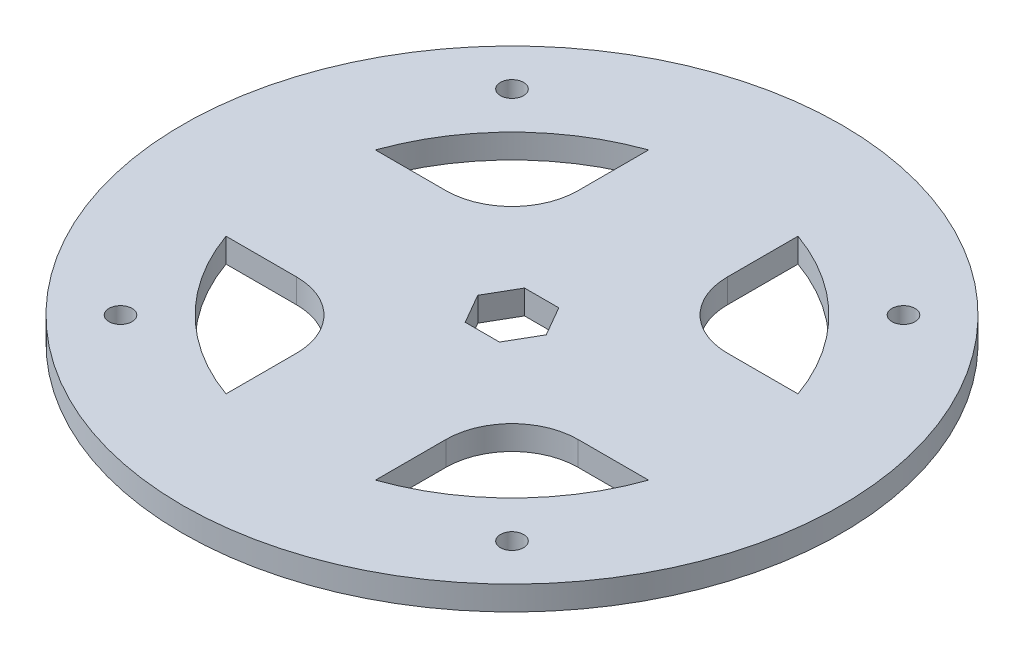
ISO-10303-21;
HEADER;
FILE_DESCRIPTION(('STEP AP214'),'2;1');
FILE_NAME('part.step','',(''),(''),'','','');
FILE_SCHEMA(('AUTOMOTIVE_DESIGN { 1 0 10303 214 1 1 1 1 }'));
ENDSEC;
DATA;
#1=APPLICATION_CONTEXT('core data for automotive mechanical design processes');
#2=APPLICATION_PROTOCOL_DEFINITION('international standard','automotive_design',2000,#1);
#3=PRODUCT_CONTEXT('',#1,'mechanical');
#4=PRODUCT('Part','Part','',(#3));
#5=PRODUCT_RELATED_PRODUCT_CATEGORY('part','',(#4));
#6=PRODUCT_DEFINITION_FORMATION('','',#4);
#7=PRODUCT_DEFINITION_CONTEXT('part definition',#1,'design');
#8=PRODUCT_DEFINITION('design','',#6,#7);
#9=PRODUCT_DEFINITION_SHAPE('','',#8);
#10=(LENGTH_UNIT() NAMED_UNIT(*) SI_UNIT(.MILLI.,.METRE.));
#11=(NAMED_UNIT(*) PLANE_ANGLE_UNIT() SI_UNIT($,.RADIAN.));
#12=(NAMED_UNIT(*) SI_UNIT($,.STERADIAN.) SOLID_ANGLE_UNIT());
#13=UNCERTAINTY_MEASURE_WITH_UNIT(LENGTH_MEASURE(1.E-05),#10,'distance_accuracy_value','');
#14=(GEOMETRIC_REPRESENTATION_CONTEXT(3) GLOBAL_UNCERTAINTY_ASSIGNED_CONTEXT((#13)) GLOBAL_UNIT_ASSIGNED_CONTEXT((#10,
#11,#12)) REPRESENTATION_CONTEXT('',''));
#15=CARTESIAN_POINT('',(0.,0.,0.));
#16=DIRECTION('',(0.,0.,1.));
#17=DIRECTION('',(1.,0.,0.));
#18=AXIS2_PLACEMENT_3D('',#15,#16,#17);
#19=CARTESIAN_POINT('',(0.,5.5,0.));
#20=DIRECTION('',(0.,1.,0.));
#21=DIRECTION('',(0.,0.,1.));
#22=AXIS2_PLACEMENT_3D('',#19,#20,#21);
#23=PLANE('',#22);
#24=CARTESIAN_POINT('',(-32.,5.5,32.));
#25=DIRECTION('',(0.,1.,0.));
#26=DIRECTION('',(0.,0.,-1.));
#27=AXIS2_PLACEMENT_3D('',#24,#25,#26);
#28=CIRCLE('',#27,15.);
#29=CARTESIAN_POINT('',(-17.,5.5,32.));
#30=VERTEX_POINT('',#29);
#31=CARTESIAN_POINT('',(-32.,5.5,17.));
#32=VERTEX_POINT('',#31);
#33=EDGE_CURVE('E55',#30,#32,#28,.T.);
#34=ORIENTED_EDGE('',*,*,#33,.F.);
#35=DIRECTION('',(0.,0.,-1.));
#36=VECTOR('',#35,1.);
#37=CARTESIAN_POINT('',(-17.,5.5,32.));
#38=LINE('',#37,#36);
#39=CARTESIAN_POINT('',(-17.,5.5,48.0832611206852));
#40=VERTEX_POINT('',#39);
#41=EDGE_CURVE('E259',#40,#30,#38,.T.);
#42=ORIENTED_EDGE('',*,*,#41,.F.);
#43=CARTESIAN_POINT('',(0.,5.5,0.));
#44=DIRECTION('',(0.,1.,0.));
#45=DIRECTION('',(0.,0.,-1.));
#46=AXIS2_PLACEMENT_3D('',#43,#44,#45);
#47=CIRCLE('',#46,51.);
#48=CARTESIAN_POINT('',(-48.0832611206852,5.5,17.));
#49=VERTEX_POINT('',#48);
#50=EDGE_CURVE('E255',#49,#40,#47,.T.);
#51=ORIENTED_EDGE('',*,*,#50,.F.);
#52=DIRECTION('',(-1.,0.,0.));
#53=VECTOR('',#52,1.);
#54=CARTESIAN_POINT('',(-32.,5.5,17.));
#55=LINE('',#54,#53);
#56=EDGE_CURVE('E250',#32,#49,#55,.T.);
#57=ORIENTED_EDGE('',*,*,#56,.F.);
#58=EDGE_LOOP('',(#34,#42,#51,#57));
#59=FACE_BOUND('',#58,.T.);
#60=CARTESIAN_POINT('',(32.,5.5,-32.));
#61=DIRECTION('',(0.,1.,0.));
#62=DIRECTION('',(0.,0.,-1.));
#63=AXIS2_PLACEMENT_3D('',#60,#61,#62);
#64=CIRCLE('',#63,15.);
#65=CARTESIAN_POINT('',(17.,5.5,-32.));
#66=VERTEX_POINT('',#65);
#67=CARTESIAN_POINT('',(32.,5.5,-17.));
#68=VERTEX_POINT('',#67);
#69=EDGE_CURVE('E63',#66,#68,#64,.T.);
#70=ORIENTED_EDGE('',*,*,#69,.F.);
#71=DIRECTION('',(0.,0.,1.));
#72=VECTOR('',#71,1.);
#73=CARTESIAN_POINT('',(17.,5.5,-32.));
#74=LINE('',#73,#72);
#75=CARTESIAN_POINT('',(17.,5.5,-48.0832611206852));
#76=VERTEX_POINT('',#75);
#77=EDGE_CURVE('E298',#76,#66,#74,.T.);
#78=ORIENTED_EDGE('',*,*,#77,.F.);
#79=CARTESIAN_POINT('',(0.,5.5,0.));
#80=DIRECTION('',(0.,1.,0.));
#81=DIRECTION('',(0.,0.,-1.));
#82=AXIS2_PLACEMENT_3D('',#79,#80,#81);
#83=CIRCLE('',#82,51.);
#84=CARTESIAN_POINT('',(48.0832611206852,5.5,-17.));
#85=VERTEX_POINT('',#84);
#86=EDGE_CURVE('E294',#85,#76,#83,.T.);
#87=ORIENTED_EDGE('',*,*,#86,.F.);
#88=DIRECTION('',(1.,0.,0.));
#89=VECTOR('',#88,1.);
#90=CARTESIAN_POINT('',(32.,5.5,-17.));
#91=LINE('',#90,#89);
#92=EDGE_CURVE('E290',#68,#85,#91,.T.);
#93=ORIENTED_EDGE('',*,*,#92,.F.);
#94=EDGE_LOOP('',(#70,#78,#87,#93));
#95=FACE_BOUND('',#94,.T.);
#96=CARTESIAN_POINT('',(-32.,5.5,-32.));
#97=DIRECTION('',(0.,1.,0.));
#98=DIRECTION('',(0.,0.,1.));
#99=AXIS2_PLACEMENT_3D('',#96,#97,#98);
#100=CIRCLE('',#99,15.);
#101=CARTESIAN_POINT('',(-32.,5.5,-17.));
#102=VERTEX_POINT('',#101);
#103=CARTESIAN_POINT('',(-17.,5.5,-32.));
#104=VERTEX_POINT('',#103);
#105=EDGE_CURVE('E214',#102,#104,#100,.T.);
#106=ORIENTED_EDGE('',*,*,#105,.F.);
#107=DIRECTION('',(1.,0.,0.));
#108=VECTOR('',#107,1.);
#109=CARTESIAN_POINT('',(-32.,5.5,-17.));
#110=LINE('',#109,#108);
#111=CARTESIAN_POINT('',(-48.0832611206852,5.5,-17.));
#112=VERTEX_POINT('',#111);
#113=EDGE_CURVE('E218',#112,#102,#110,.T.);
#114=ORIENTED_EDGE('',*,*,#113,.F.);
#115=CARTESIAN_POINT('',(0.,5.5,0.));
#116=DIRECTION('',(0.,1.,0.));
#117=DIRECTION('',(0.,0.,1.));
#118=AXIS2_PLACEMENT_3D('',#115,#116,#117);
#119=CIRCLE('',#118,51.);
#120=CARTESIAN_POINT('',(-17.,5.5,-48.0832611206852));
#121=VERTEX_POINT('',#120);
#122=EDGE_CURVE('E196',#121,#112,#119,.T.);
#123=ORIENTED_EDGE('',*,*,#122,.F.);
#124=DIRECTION('',(0.,0.,-1.));
#125=VECTOR('',#124,1.);
#126=CARTESIAN_POINT('',(-17.,5.5,-32.));
#127=LINE('',#126,#125);
#128=EDGE_CURVE('E208',#104,#121,#127,.T.);
#129=ORIENTED_EDGE('',*,*,#128,.F.);
#130=EDGE_LOOP('',(#106,#114,#123,#129));
#131=FACE_BOUND('',#130,.T.);
#132=CARTESIAN_POINT('',(0.,5.5,0.));
#133=DIRECTION('',(0.,1.,0.));
#134=DIRECTION('',(0.,0.,1.));
#135=AXIS2_PLACEMENT_3D('',#132,#133,#134);
#136=CIRCLE('',#135,51.);
#137=CARTESIAN_POINT('',(17.,5.5,48.0832611206852));
#138=VERTEX_POINT('',#137);
#139=CARTESIAN_POINT('',(48.0832611206852,5.5,17.));
#140=VERTEX_POINT('',#139);
#141=EDGE_CURVE('E276',#138,#140,#136,.T.);
#142=ORIENTED_EDGE('',*,*,#141,.F.);
#143=DIRECTION('',(0.,0.,1.));
#144=VECTOR('',#143,1.);
#145=CARTESIAN_POINT('',(17.,5.5,32.));
#146=LINE('',#145,#144);
#147=CARTESIAN_POINT('',(17.,5.5,32.));
#148=VERTEX_POINT('',#147);
#149=EDGE_CURVE('E337',#148,#138,#146,.T.);
#150=ORIENTED_EDGE('',*,*,#149,.F.);
#151=CARTESIAN_POINT('',(32.,5.5,32.));
#152=DIRECTION('',(0.,1.,0.));
#153=DIRECTION('',(0.,0.,1.));
#154=AXIS2_PLACEMENT_3D('',#151,#152,#153);
#155=CIRCLE('',#154,15.);
#156=CARTESIAN_POINT('',(32.,5.5,17.));
#157=VERTEX_POINT('',#156);
#158=EDGE_CURVE('E333',#157,#148,#155,.T.);
#159=ORIENTED_EDGE('',*,*,#158,.F.);
#160=DIRECTION('',(-1.,0.,0.));
#161=VECTOR('',#160,1.);
#162=CARTESIAN_POINT('',(32.,5.5,17.));
#163=LINE('',#162,#161);
#164=EDGE_CURVE('E329',#140,#157,#163,.T.);
#165=ORIENTED_EDGE('',*,*,#164,.F.);
#166=EDGE_LOOP('',(#142,#150,#159,#165));
#167=FACE_BOUND('',#166,.T.);
#168=CARTESIAN_POINT('',(-44.5477272147521,5.5,44.5477272147529));
#169=DIRECTION('',(0.,1.,0.));
#170=DIRECTION('',(0.,0.,1.));
#171=AXIS2_PLACEMENT_3D('',#168,#169,#170);
#172=CIRCLE('',#171,2.625);
#173=CARTESIAN_POINT('',(-44.5477272147521,5.5,47.1727272147529));
#174=VERTEX_POINT('',#173);
#175=EDGE_CURVE('E425',#174,#174,#172,.T.);
#176=ORIENTED_EDGE('',*,*,#175,.F.);
#177=EDGE_LOOP('',(#176));
#178=FACE_BOUND('',#177,.T.);
#179=CARTESIAN_POINT('',(44.5477272147524,5.5,-44.5477272147526));
#180=DIRECTION('',(0.,1.,0.));
#181=DIRECTION('',(0.,0.,1.));
#182=AXIS2_PLACEMENT_3D('',#179,#180,#181);
#183=CIRCLE('',#182,2.625);
#184=CARTESIAN_POINT('',(44.5477272147524,5.5,-41.9227272147526));
#185=VERTEX_POINT('',#184);
#186=EDGE_CURVE('E365',#185,#185,#183,.T.);
#187=ORIENTED_EDGE('',*,*,#186,.F.);
#188=EDGE_LOOP('',(#187));
#189=FACE_BOUND('',#188,.T.);
#190=CARTESIAN_POINT('',(-44.5477272147527,5.5,-44.5477272147523));
#191=DIRECTION('',(0.,1.,0.));
#192=DIRECTION('',(0.,0.,1.));
#193=AXIS2_PLACEMENT_3D('',#190,#191,#192);
#194=CIRCLE('',#193,2.625);
#195=CARTESIAN_POINT('',(-44.5477272147527,5.5,-41.9227272147523));
#196=VERTEX_POINT('',#195);
#197=EDGE_CURVE('E356',#196,#196,#194,.T.);
#198=ORIENTED_EDGE('',*,*,#197,.F.);
#199=EDGE_LOOP('',(#198));
#200=FACE_BOUND('',#199,.T.);
#201=DIRECTION('',(0.5,0.,-0.866025403784439));
#202=VECTOR('',#201,1.);
#203=CARTESIAN_POINT('',(3.89711431702998,5.5,6.75));
#204=LINE('',#203,#202);
#205=CARTESIAN_POINT('',(3.89711431702998,5.5,6.75));
#206=VERTEX_POINT('',#205);
#207=CARTESIAN_POINT('',(7.79422863405995,5.5,0.));
#208=VERTEX_POINT('',#207);
#209=EDGE_CURVE('E355',#206,#208,#204,.T.);
#210=ORIENTED_EDGE('',*,*,#209,.F.);
#211=DIRECTION('',(1.,0.,0.));
#212=VECTOR('',#211,1.);
#213=CARTESIAN_POINT('',(-3.89711431702997,5.5,6.75));
#214=LINE('',#213,#212);
#215=CARTESIAN_POINT('',(-3.89711431702997,5.5,6.75));
#216=VERTEX_POINT('',#215);
#217=EDGE_CURVE('E401',#216,#206,#214,.T.);
#218=ORIENTED_EDGE('',*,*,#217,.F.);
#219=DIRECTION('',(0.5,0.,0.866025403784439));
#220=VECTOR('',#219,1.);
#221=CARTESIAN_POINT('',(-7.79422863405995,5.5,0.));
#222=LINE('',#221,#220);
#223=CARTESIAN_POINT('',(-7.79422863405995,5.5,0.));
#224=VERTEX_POINT('',#223);
#225=EDGE_CURVE('E397',#224,#216,#222,.T.);
#226=ORIENTED_EDGE('',*,*,#225,.F.);
#227=DIRECTION('',(-0.5,0.,0.866025403784439));
#228=VECTOR('',#227,1.);
#229=CARTESIAN_POINT('',(-3.89711431702998,5.5,-6.75));
#230=LINE('',#229,#228);
#231=CARTESIAN_POINT('',(-3.89711431702998,5.5,-6.75));
#232=VERTEX_POINT('',#231);
#233=EDGE_CURVE('E393',#232,#224,#230,.T.);
#234=ORIENTED_EDGE('',*,*,#233,.F.);
#235=DIRECTION('',(-1.,0.,0.));
#236=VECTOR('',#235,1.);
#237=CARTESIAN_POINT('',(3.89711431702997,5.5,-6.75));
#238=LINE('',#237,#236);
#239=CARTESIAN_POINT('',(3.89711431702997,5.5,-6.75));
#240=VERTEX_POINT('',#239);
#241=EDGE_CURVE('E389',#240,#232,#238,.T.);
#242=ORIENTED_EDGE('',*,*,#241,.F.);
#243=DIRECTION('',(-0.500000000000001,0.,-0.866025403784438));
#244=VECTOR('',#243,1.);
#245=CARTESIAN_POINT('',(7.79422863405995,5.5,0.));
#246=LINE('',#245,#244);
#247=EDGE_CURVE('E385',#208,#240,#246,.T.);
#248=ORIENTED_EDGE('',*,*,#247,.F.);
#249=EDGE_LOOP('',(#210,#218,#226,#234,#242,#248));
#250=FACE_BOUND('',#249,.T.);
#251=CARTESIAN_POINT('',(44.547727214753,5.5,44.547727214752));
#252=DIRECTION('',(0.,1.,0.));
#253=DIRECTION('',(0.,0.,1.));
#254=AXIS2_PLACEMENT_3D('',#251,#252,#253);
#255=CIRCLE('',#254,2.625);
#256=CARTESIAN_POINT('',(44.547727214753,5.5,47.172727214752));
#257=VERTEX_POINT('',#256);
#258=EDGE_CURVE('E434',#257,#257,#255,.T.);
#259=ORIENTED_EDGE('',*,*,#258,.F.);
#260=EDGE_LOOP('',(#259));
#261=FACE_BOUND('',#260,.T.);
#262=CARTESIAN_POINT('',(0.,5.5,0.));
#263=DIRECTION('',(0.,1.,0.));
#264=DIRECTION('',(0.,0.,1.));
#265=AXIS2_PLACEMENT_3D('',#262,#263,#264);
#266=CIRCLE('',#265,75.);
#267=CARTESIAN_POINT('',(0.,5.5,75.));
#268=VERTEX_POINT('',#267);
#269=EDGE_CURVE('E11',#268,#268,#266,.T.);
#270=ORIENTED_EDGE('',*,*,#269,.T.);
#271=EDGE_LOOP('',(#270));
#272=FACE_BOUND('',#271,.T.);
#273=ADVANCED_FACE('F39',(#59,#95,#131,#167,#178,#189,#200,#250,#261,#272),#23,.T.);
#274=CARTESIAN_POINT('',(0.,0.,0.));
#275=DIRECTION('',(0.,1.,0.));
#276=DIRECTION('',(0.,0.,1.));
#277=AXIS2_PLACEMENT_3D('',#274,#275,#276);
#278=PLANE('',#277);
#279=DIRECTION('',(0.,0.,1.));
#280=VECTOR('',#279,1.);
#281=CARTESIAN_POINT('',(-17.,0.,32.));
#282=LINE('',#281,#280);
#283=CARTESIAN_POINT('',(-17.,0.,32.));
#284=VERTEX_POINT('',#283);
#285=CARTESIAN_POINT('',(-17.,0.,48.0832611206852));
#286=VERTEX_POINT('',#285);
#287=EDGE_CURVE('E240',#284,#286,#282,.T.);
#288=ORIENTED_EDGE('',*,*,#287,.F.);
#289=CARTESIAN_POINT('',(-32.,0.,32.));
#290=DIRECTION('',(0.,1.,0.));
#291=DIRECTION('',(0.,0.,1.));
#292=AXIS2_PLACEMENT_3D('',#289,#290,#291);
#293=CIRCLE('',#292,15.);
#294=CARTESIAN_POINT('',(-32.,0.,17.));
#295=VERTEX_POINT('',#294);
#296=EDGE_CURVE('E244',#295,#284,#293,.F.);
#297=ORIENTED_EDGE('',*,*,#296,.F.);
#298=DIRECTION('',(1.,0.,0.));
#299=VECTOR('',#298,1.);
#300=CARTESIAN_POINT('',(-32.,0.,17.));
#301=LINE('',#300,#299);
#302=CARTESIAN_POINT('',(-48.0832611206852,0.,17.));
#303=VERTEX_POINT('',#302);
#304=EDGE_CURVE('E247',#303,#295,#301,.T.);
#305=ORIENTED_EDGE('',*,*,#304,.F.);
#306=CARTESIAN_POINT('',(0.,0.,0.));
#307=DIRECTION('',(0.,1.,0.));
#308=DIRECTION('',(0.,0.,1.));
#309=AXIS2_PLACEMENT_3D('',#306,#307,#308);
#310=CIRCLE('',#309,51.);
#311=EDGE_CURVE('E236',#286,#303,#310,.F.);
#312=ORIENTED_EDGE('',*,*,#311,.F.);
#313=EDGE_LOOP('',(#288,#297,#305,#312));
#314=FACE_BOUND('',#313,.T.);
#315=DIRECTION('',(0.,0.,-1.));
#316=VECTOR('',#315,1.);
#317=CARTESIAN_POINT('',(17.,0.,-32.));
#318=LINE('',#317,#316);
#319=CARTESIAN_POINT('',(17.,0.,-32.));
#320=VERTEX_POINT('',#319);
#321=CARTESIAN_POINT('',(17.,0.,-48.0832611206852));
#322=VERTEX_POINT('',#321);
#323=EDGE_CURVE('E281',#320,#322,#318,.T.);
#324=ORIENTED_EDGE('',*,*,#323,.F.);
#325=CARTESIAN_POINT('',(32.,0.,-32.));
#326=DIRECTION('',(0.,1.,0.));
#327=DIRECTION('',(0.,0.,1.));
#328=AXIS2_PLACEMENT_3D('',#325,#326,#327);
#329=CIRCLE('',#328,15.);
#330=CARTESIAN_POINT('',(32.,0.,-17.));
#331=VERTEX_POINT('',#330);
#332=EDGE_CURVE('E285',#331,#320,#329,.F.);
#333=ORIENTED_EDGE('',*,*,#332,.F.);
#334=DIRECTION('',(-1.,0.,0.));
#335=VECTOR('',#334,1.);
#336=CARTESIAN_POINT('',(32.,0.,-17.));
#337=LINE('',#336,#335);
#338=CARTESIAN_POINT('',(48.0832611206852,0.,-17.));
#339=VERTEX_POINT('',#338);
#340=EDGE_CURVE('E251',#339,#331,#337,.T.);
#341=ORIENTED_EDGE('',*,*,#340,.F.);
#342=CARTESIAN_POINT('',(0.,0.,0.));
#343=DIRECTION('',(0.,1.,0.));
#344=DIRECTION('',(0.,0.,1.));
#345=AXIS2_PLACEMENT_3D('',#342,#343,#344);
#346=CIRCLE('',#345,51.);
#347=EDGE_CURVE('E277',#322,#339,#346,.F.);
#348=ORIENTED_EDGE('',*,*,#347,.F.);
#349=EDGE_LOOP('',(#324,#333,#341,#348));
#350=FACE_BOUND('',#349,.T.);
#351=DIRECTION('',(-1.,0.,0.));
#352=VECTOR('',#351,1.);
#353=CARTESIAN_POINT('',(-32.,0.,-17.));
#354=LINE('',#353,#352);
#355=CARTESIAN_POINT('',(-32.,0.,-17.));
#356=VERTEX_POINT('',#355);
#357=CARTESIAN_POINT('',(-48.0832611206852,0.,-17.));
#358=VERTEX_POINT('',#357);
#359=EDGE_CURVE('E567',#356,#358,#354,.T.);
#360=ORIENTED_EDGE('',*,*,#359,.F.);
#361=CARTESIAN_POINT('',(-32.,0.,-32.));
#362=DIRECTION('',(0.,1.,0.));
#363=DIRECTION('',(0.,0.,1.));
#364=AXIS2_PLACEMENT_3D('',#361,#362,#363);
#365=CIRCLE('',#364,15.);
#366=CARTESIAN_POINT('',(-17.,0.,-32.));
#367=VERTEX_POINT('',#366);
#368=EDGE_CURVE('E235',#367,#356,#365,.F.);
#369=ORIENTED_EDGE('',*,*,#368,.F.);
#370=DIRECTION('',(0.,0.,1.));
#371=VECTOR('',#370,1.);
#372=CARTESIAN_POINT('',(-17.,0.,-32.));
#373=LINE('',#372,#371);
#374=CARTESIAN_POINT('',(-17.,0.,-48.0832611206852));
#375=VERTEX_POINT('',#374);
#376=EDGE_CURVE('E232',#375,#367,#373,.T.);
#377=ORIENTED_EDGE('',*,*,#376,.F.);
#378=CARTESIAN_POINT('',(0.,0.,0.));
#379=DIRECTION('',(0.,1.,0.));
#380=DIRECTION('',(0.,0.,1.));
#381=AXIS2_PLACEMENT_3D('',#378,#379,#380);
#382=CIRCLE('',#381,51.);
#383=EDGE_CURVE('E199',#358,#375,#382,.F.);
#384=ORIENTED_EDGE('',*,*,#383,.F.);
#385=EDGE_LOOP('',(#360,#369,#377,#384));
#386=FACE_BOUND('',#385,.T.);
#387=DIRECTION('',(0.,0.,-1.));
#388=VECTOR('',#387,1.);
#389=CARTESIAN_POINT('',(17.,0.,32.));
#390=LINE('',#389,#388);
#391=CARTESIAN_POINT('',(17.,0.,48.0832611206852));
#392=VERTEX_POINT('',#391);
#393=CARTESIAN_POINT('',(17.,0.,32.));
#394=VERTEX_POINT('',#393);
#395=EDGE_CURVE('E319',#392,#394,#390,.T.);
#396=ORIENTED_EDGE('',*,*,#395,.F.);
#397=CARTESIAN_POINT('',(0.,0.,0.));
#398=DIRECTION('',(0.,1.,0.));
#399=DIRECTION('',(0.,0.,1.));
#400=AXIS2_PLACEMENT_3D('',#397,#398,#399);
#401=CIRCLE('',#400,51.);
#402=CARTESIAN_POINT('',(48.0832611206852,0.,17.));
#403=VERTEX_POINT('',#402);
#404=EDGE_CURVE('E323',#403,#392,#401,.F.);
#405=ORIENTED_EDGE('',*,*,#404,.F.);
#406=DIRECTION('',(1.,0.,0.));
#407=VECTOR('',#406,1.);
#408=CARTESIAN_POINT('',(32.,0.,17.));
#409=LINE('',#408,#407);
#410=CARTESIAN_POINT('',(32.,0.,17.));
#411=VERTEX_POINT('',#410);
#412=EDGE_CURVE('E326',#411,#403,#409,.T.);
#413=ORIENTED_EDGE('',*,*,#412,.F.);
#414=CARTESIAN_POINT('',(32.,0.,32.));
#415=DIRECTION('',(0.,1.,0.));
#416=DIRECTION('',(0.,0.,1.));
#417=AXIS2_PLACEMENT_3D('',#414,#415,#416);
#418=CIRCLE('',#417,15.);
#419=EDGE_CURVE('E315',#394,#411,#418,.F.);
#420=ORIENTED_EDGE('',*,*,#419,.F.);
#421=EDGE_LOOP('',(#396,#405,#413,#420));
#422=FACE_BOUND('',#421,.T.);
#423=CARTESIAN_POINT('',(-44.5477272147521,0.,44.5477272147529));
#424=DIRECTION('',(0.,1.,0.));
#425=DIRECTION('',(0.,0.,1.));
#426=AXIS2_PLACEMENT_3D('',#423,#424,#425);
#427=CIRCLE('',#426,2.625);
#428=CARTESIAN_POINT('',(-44.5477272147521,0.,47.1727272147529));
#429=VERTEX_POINT('',#428);
#430=EDGE_CURVE('E429',#429,#429,#427,.F.);
#431=ORIENTED_EDGE('',*,*,#430,.F.);
#432=EDGE_LOOP('',(#431));
#433=FACE_BOUND('',#432,.T.);
#434=CARTESIAN_POINT('',(44.5477272147524,0.,-44.5477272147526));
#435=DIRECTION('',(0.,1.,0.));
#436=DIRECTION('',(0.,0.,1.));
#437=AXIS2_PLACEMENT_3D('',#434,#435,#436);
#438=CIRCLE('',#437,2.625);
#439=CARTESIAN_POINT('',(44.5477272147524,0.,-41.9227272147526));
#440=VERTEX_POINT('',#439);
#441=EDGE_CURVE('E430',#440,#440,#438,.F.);
#442=ORIENTED_EDGE('',*,*,#441,.F.);
#443=EDGE_LOOP('',(#442));
#444=FACE_BOUND('',#443,.T.);
#445=CARTESIAN_POINT('',(-44.5477272147527,0.,-44.5477272147523));
#446=DIRECTION('',(0.,1.,0.));
#447=DIRECTION('',(0.,0.,1.));
#448=AXIS2_PLACEMENT_3D('',#445,#446,#447);
#449=CIRCLE('',#448,2.625);
#450=CARTESIAN_POINT('',(-44.5477272147527,0.,-41.9227272147523));
#451=VERTEX_POINT('',#450);
#452=EDGE_CURVE('E360',#451,#451,#449,.F.);
#453=ORIENTED_EDGE('',*,*,#452,.F.);
#454=EDGE_LOOP('',(#453));
#455=FACE_BOUND('',#454,.T.);
#456=DIRECTION('',(-1.,0.,0.));
#457=VECTOR('',#456,1.);
#458=CARTESIAN_POINT('',(-3.89711431702997,0.,6.75));
#459=LINE('',#458,#457);
#460=CARTESIAN_POINT('',(3.89711431702998,0.,6.75));
#461=VERTEX_POINT('',#460);
#462=CARTESIAN_POINT('',(-3.89711431702997,0.,6.75));
#463=VERTEX_POINT('',#462);
#464=EDGE_CURVE('E377',#461,#463,#459,.T.);
#465=ORIENTED_EDGE('',*,*,#464,.F.);
#466=DIRECTION('',(-0.5,0.,0.866025403784439));
#467=VECTOR('',#466,1.);
#468=CARTESIAN_POINT('',(3.89711431702998,0.,6.75));
#469=LINE('',#468,#467);
#470=CARTESIAN_POINT('',(7.79422863405995,0.,0.));
#471=VERTEX_POINT('',#470);
#472=EDGE_CURVE('E380',#471,#461,#469,.T.);
#473=ORIENTED_EDGE('',*,*,#472,.F.);
#474=DIRECTION('',(0.500000000000001,0.,0.866025403784438));
#475=VECTOR('',#474,1.);
#476=CARTESIAN_POINT('',(7.79422863405995,0.,0.));
#477=LINE('',#476,#475);
#478=CARTESIAN_POINT('',(3.89711431702997,0.,-6.75));
#479=VERTEX_POINT('',#478);
#480=EDGE_CURVE('E361',#479,#471,#477,.T.);
#481=ORIENTED_EDGE('',*,*,#480,.F.);
#482=DIRECTION('',(1.,0.,0.));
#483=VECTOR('',#482,1.);
#484=CARTESIAN_POINT('',(3.89711431702997,0.,-6.75));
#485=LINE('',#484,#483);
#486=CARTESIAN_POINT('',(-3.89711431702998,0.,-6.75));
#487=VERTEX_POINT('',#486);
#488=EDGE_CURVE('E366',#487,#479,#485,.T.);
#489=ORIENTED_EDGE('',*,*,#488,.F.);
#490=DIRECTION('',(0.5,0.,-0.866025403784439));
#491=VECTOR('',#490,1.);
#492=CARTESIAN_POINT('',(-3.89711431702998,0.,-6.75));
#493=LINE('',#492,#491);
#494=CARTESIAN_POINT('',(-7.79422863405995,0.,0.));
#495=VERTEX_POINT('',#494);
#496=EDGE_CURVE('E370',#495,#487,#493,.T.);
#497=ORIENTED_EDGE('',*,*,#496,.F.);
#498=DIRECTION('',(-0.5,0.,-0.866025403784439));
#499=VECTOR('',#498,1.);
#500=CARTESIAN_POINT('',(-7.79422863405995,0.,0.));
#501=LINE('',#500,#499);
#502=EDGE_CURVE('E374',#463,#495,#501,.T.);
#503=ORIENTED_EDGE('',*,*,#502,.F.);
#504=EDGE_LOOP('',(#465,#473,#481,#489,#497,#503));
#505=FACE_BOUND('',#504,.T.);
#506=CARTESIAN_POINT('',(44.547727214753,0.,44.547727214752));
#507=DIRECTION('',(0.,1.,0.));
#508=DIRECTION('',(0.,0.,1.));
#509=AXIS2_PLACEMENT_3D('',#506,#507,#508);
#510=CIRCLE('',#509,2.625);
#511=CARTESIAN_POINT('',(44.547727214753,0.,47.172727214752));
#512=VERTEX_POINT('',#511);
#513=EDGE_CURVE('E444',#512,#512,#510,.F.);
#514=ORIENTED_EDGE('',*,*,#513,.F.);
#515=EDGE_LOOP('',(#514));
#516=FACE_BOUND('',#515,.T.);
#517=CARTESIAN_POINT('',(0.,0.,0.));
#518=DIRECTION('',(0.,1.,0.));
#519=DIRECTION('',(0.,0.,1.));
#520=AXIS2_PLACEMENT_3D('',#517,#518,#519);
#521=CIRCLE('',#520,75.);
#522=CARTESIAN_POINT('',(0.,0.,75.));
#523=VERTEX_POINT('',#522);
#524=EDGE_CURVE('E43',#523,#523,#521,.T.);
#525=ORIENTED_EDGE('',*,*,#524,.F.);
#526=EDGE_LOOP('',(#525));
#527=FACE_BOUND('',#526,.T.);
#528=ADVANCED_FACE('F454',(#314,#350,#386,#422,#433,#444,#455,#505,#516,#527),#278,.F.);
#529=CARTESIAN_POINT('',(0.,5.5,0.));
#530=DIRECTION('',(0.,-1.,0.));
#531=DIRECTION('',(0.,0.,-1.));
#532=AXIS2_PLACEMENT_3D('',#529,#530,#531);
#533=CYLINDRICAL_SURFACE('',#532,75.);
#534=ORIENTED_EDGE('',*,*,#269,.F.);
#535=EDGE_LOOP('',(#534));
#536=FACE_BOUND('',#535,.T.);
#537=ORIENTED_EDGE('',*,*,#524,.T.);
#538=EDGE_LOOP('',(#537));
#539=FACE_BOUND('',#538,.T.);
#540=ADVANCED_FACE('F41',(#536,#539),#533,.T.);
#541=CARTESIAN_POINT('',(44.547727214753,-20.6215906273013,44.547727214752));
#542=DIRECTION('',(0.,1.,0.));
#543=DIRECTION('',(0.,0.,1.));
#544=AXIS2_PLACEMENT_3D('',#541,#542,#543);
#545=CYLINDRICAL_SURFACE('',#544,2.625);
#546=ORIENTED_EDGE('',*,*,#513,.T.);
#547=EDGE_LOOP('',(#546));
#548=FACE_BOUND('',#547,.T.);
#549=ORIENTED_EDGE('',*,*,#258,.T.);
#550=EDGE_LOOP('',(#549));
#551=FACE_BOUND('',#550,.T.);
#552=ADVANCED_FACE('F461',(#548,#551),#545,.F.);
#553=CARTESIAN_POINT('',(3.89711431702998,-20.6215906273013,6.75));
#554=DIRECTION('',(0.866025403784439,0.,0.5));
#555=DIRECTION('',(0.5,0.,-0.866025403784439));
#556=AXIS2_PLACEMENT_3D('',#553,#554,#555);
#557=PLANE('',#556);
#558=ORIENTED_EDGE('',*,*,#472,.T.);
#559=DIRECTION('',(0.,1.,0.));
#560=VECTOR('',#559,1.);
#561=CARTESIAN_POINT('',(3.89711431702998,-20.6215906273013,6.75));
#562=LINE('',#561,#560);
#563=EDGE_CURVE('E371',#461,#206,#562,.T.);
#564=ORIENTED_EDGE('',*,*,#563,.T.);
#565=ORIENTED_EDGE('',*,*,#209,.T.);
#566=DIRECTION('',(0.,1.,0.));
#567=VECTOR('',#566,1.);
#568=CARTESIAN_POINT('',(7.79422863405995,-20.6215906273013,0.));
#569=LINE('',#568,#567);
#570=EDGE_CURVE('E405',#471,#208,#569,.T.);
#571=ORIENTED_EDGE('',*,*,#570,.F.);
#572=EDGE_LOOP('',(#558,#564,#565,#571));
#573=FACE_BOUND('',#572,.T.);
#574=ADVANCED_FACE('F470',(#573),#557,.F.);
#575=CARTESIAN_POINT('',(-3.89711431702997,-20.6215906273013,6.75));
#576=DIRECTION('',(0.,0.,1.));
#577=DIRECTION('',(1.,0.,0.));
#578=AXIS2_PLACEMENT_3D('',#575,#576,#577);
#579=PLANE('',#578);
#580=ORIENTED_EDGE('',*,*,#464,.T.);
#581=DIRECTION('',(0.,1.,0.));
#582=VECTOR('',#581,1.);
#583=CARTESIAN_POINT('',(-3.89711431702997,-20.6215906273013,6.75));
#584=LINE('',#583,#582);
#585=EDGE_CURVE('E408',#463,#216,#584,.T.);
#586=ORIENTED_EDGE('',*,*,#585,.T.);
#587=ORIENTED_EDGE('',*,*,#217,.T.);
#588=ORIENTED_EDGE('',*,*,#563,.F.);
#589=EDGE_LOOP('',(#580,#586,#587,#588));
#590=FACE_BOUND('',#589,.T.);
#591=ADVANCED_FACE('F483',(#590),#579,.F.);
#592=CARTESIAN_POINT('',(-7.79422863405995,-20.6215906273013,0.));
#593=DIRECTION('',(-0.866025403784439,0.,0.5));
#594=DIRECTION('',(0.5,0.,0.866025403784439));
#595=AXIS2_PLACEMENT_3D('',#592,#593,#594);
#596=PLANE('',#595);
#597=ORIENTED_EDGE('',*,*,#502,.T.);
#598=DIRECTION('',(0.,1.,0.));
#599=VECTOR('',#598,1.);
#600=CARTESIAN_POINT('',(-7.79422863405995,-20.6215906273013,0.));
#601=LINE('',#600,#599);
#602=EDGE_CURVE('E411',#495,#224,#601,.T.);
#603=ORIENTED_EDGE('',*,*,#602,.T.);
#604=ORIENTED_EDGE('',*,*,#225,.T.);
#605=ORIENTED_EDGE('',*,*,#585,.F.);
#606=EDGE_LOOP('',(#597,#603,#604,#605));
#607=FACE_BOUND('',#606,.T.);
#608=ADVANCED_FACE('F496',(#607),#596,.F.);
#609=CARTESIAN_POINT('',(-3.89711431702998,-20.6215906273013,-6.75));
#610=DIRECTION('',(-0.866025403784439,0.,-0.5));
#611=DIRECTION('',(-0.5,0.,0.866025403784439));
#612=AXIS2_PLACEMENT_3D('',#609,#610,#611);
#613=PLANE('',#612);
#614=ORIENTED_EDGE('',*,*,#496,.T.);
#615=DIRECTION('',(0.,1.,0.));
#616=VECTOR('',#615,1.);
#617=CARTESIAN_POINT('',(-3.89711431702998,-20.6215906273013,-6.75));
#618=LINE('',#617,#616);
#619=EDGE_CURVE('E414',#487,#232,#618,.T.);
#620=ORIENTED_EDGE('',*,*,#619,.T.);
#621=ORIENTED_EDGE('',*,*,#233,.T.);
#622=ORIENTED_EDGE('',*,*,#602,.F.);
#623=EDGE_LOOP('',(#614,#620,#621,#622));
#624=FACE_BOUND('',#623,.T.);
#625=ADVANCED_FACE('F492',(#624),#613,.F.);
#626=CARTESIAN_POINT('',(3.89711431702997,-20.6215906273013,-6.75));
#627=DIRECTION('',(0.,0.,-1.));
#628=DIRECTION('',(-1.,0.,0.));
#629=AXIS2_PLACEMENT_3D('',#626,#627,#628);
#630=PLANE('',#629);
#631=ORIENTED_EDGE('',*,*,#488,.T.);
#632=DIRECTION('',(0.,1.,0.));
#633=VECTOR('',#632,1.);
#634=CARTESIAN_POINT('',(3.89711431702997,-20.6215906273013,-6.75));
#635=LINE('',#634,#633);
#636=EDGE_CURVE('E417',#479,#240,#635,.T.);
#637=ORIENTED_EDGE('',*,*,#636,.T.);
#638=ORIENTED_EDGE('',*,*,#241,.T.);
#639=ORIENTED_EDGE('',*,*,#619,.F.);
#640=EDGE_LOOP('',(#631,#637,#638,#639));
#641=FACE_BOUND('',#640,.T.);
#642=ADVANCED_FACE('F488',(#641),#630,.F.);
#643=CARTESIAN_POINT('',(7.79422863405995,-20.6215906273013,0.));
#644=DIRECTION('',(0.866025403784438,0.,-0.500000000000001));
#645=DIRECTION('',(-0.500000000000001,0.,-0.866025403784438));
#646=AXIS2_PLACEMENT_3D('',#643,#644,#645);
#647=PLANE('',#646);
#648=ORIENTED_EDGE('',*,*,#480,.T.);
#649=ORIENTED_EDGE('',*,*,#570,.T.);
#650=ORIENTED_EDGE('',*,*,#247,.T.);
#651=ORIENTED_EDGE('',*,*,#636,.F.);
#652=EDGE_LOOP('',(#648,#649,#650,#651));
#653=FACE_BOUND('',#652,.T.);
#654=ADVANCED_FACE('F485',(#653),#647,.F.);
#655=CARTESIAN_POINT('',(-44.5477272147527,-20.6215906273013,-44.5477272147523));
#656=DIRECTION('',(0.,1.,0.));
#657=DIRECTION('',(0.,0.,1.));
#658=AXIS2_PLACEMENT_3D('',#655,#656,#657);
#659=CYLINDRICAL_SURFACE('',#658,2.625);
#660=ORIENTED_EDGE('',*,*,#452,.T.);
#661=EDGE_LOOP('',(#660));
#662=FACE_BOUND('',#661,.T.);
#663=ORIENTED_EDGE('',*,*,#197,.T.);
#664=EDGE_LOOP('',(#663));
#665=FACE_BOUND('',#664,.T.);
#666=ADVANCED_FACE('F475',(#662,#665),#659,.F.);
#667=CARTESIAN_POINT('',(44.5477272147524,-20.6215906273013,-44.5477272147526));
#668=DIRECTION('',(0.,1.,0.));
#669=DIRECTION('',(0.,0.,1.));
#670=AXIS2_PLACEMENT_3D('',#667,#668,#669);
#671=CYLINDRICAL_SURFACE('',#670,2.625);
#672=ORIENTED_EDGE('',*,*,#441,.T.);
#673=EDGE_LOOP('',(#672));
#674=FACE_BOUND('',#673,.T.);
#675=ORIENTED_EDGE('',*,*,#186,.T.);
#676=EDGE_LOOP('',(#675));
#677=FACE_BOUND('',#676,.T.);
#678=ADVANCED_FACE('F471',(#674,#677),#671,.F.);
#679=CARTESIAN_POINT('',(-44.5477272147521,-20.6215906273013,44.5477272147529));
#680=DIRECTION('',(0.,1.,0.));
#681=DIRECTION('',(0.,0.,1.));
#682=AXIS2_PLACEMENT_3D('',#679,#680,#681);
#683=CYLINDRICAL_SURFACE('',#682,2.625);
#684=ORIENTED_EDGE('',*,*,#430,.T.);
#685=EDGE_LOOP('',(#684));
#686=FACE_BOUND('',#685,.T.);
#687=ORIENTED_EDGE('',*,*,#175,.T.);
#688=EDGE_LOOP('',(#687));
#689=FACE_BOUND('',#688,.T.);
#690=ADVANCED_FACE('F474',(#686,#689),#683,.F.);
#691=CARTESIAN_POINT('',(0.,-43.9583694396574,0.));
#692=DIRECTION('',(0.,1.,0.));
#693=DIRECTION('',(0.,0.,1.));
#694=AXIS2_PLACEMENT_3D('',#691,#692,#693);
#695=CYLINDRICAL_SURFACE('',#694,51.);
#696=ORIENTED_EDGE('',*,*,#404,.T.);
#697=DIRECTION('',(0.,1.,0.));
#698=VECTOR('',#697,1.);
#699=CARTESIAN_POINT('',(17.,-43.9583694396574,48.0832611206852));
#700=LINE('',#699,#698);
#701=EDGE_CURVE('E320',#392,#138,#700,.T.);
#702=ORIENTED_EDGE('',*,*,#701,.T.);
#703=ORIENTED_EDGE('',*,*,#141,.T.);
#704=DIRECTION('',(0.,1.,0.));
#705=VECTOR('',#704,1.);
#706=CARTESIAN_POINT('',(48.0832611206852,-43.9583694396574,17.));
#707=LINE('',#706,#705);
#708=EDGE_CURVE('E341',#403,#140,#707,.T.);
#709=ORIENTED_EDGE('',*,*,#708,.F.);
#710=EDGE_LOOP('',(#696,#702,#703,#709));
#711=FACE_BOUND('',#710,.T.);
#712=ADVANCED_FACE('F479',(#711),#695,.F.);
#713=CARTESIAN_POINT('',(17.,-43.9583694396574,32.));
#714=DIRECTION('',(-1.,0.,0.));
#715=DIRECTION('',(0.,0.,1.));
#716=AXIS2_PLACEMENT_3D('',#713,#714,#715);
#717=PLANE('',#716);
#718=ORIENTED_EDGE('',*,*,#395,.T.);
#719=DIRECTION('',(0.,1.,0.));
#720=VECTOR('',#719,1.);
#721=CARTESIAN_POINT('',(17.,-43.9583694396574,32.));
#722=LINE('',#721,#720);
#723=EDGE_CURVE('E344',#394,#148,#722,.T.);
#724=ORIENTED_EDGE('',*,*,#723,.T.);
#725=ORIENTED_EDGE('',*,*,#149,.T.);
#726=ORIENTED_EDGE('',*,*,#701,.F.);
#727=EDGE_LOOP('',(#718,#724,#725,#726));
#728=FACE_BOUND('',#727,.T.);
#729=ADVANCED_FACE('F509',(#728),#717,.F.);
#730=CARTESIAN_POINT('',(32.,-43.9583694396574,32.));
#731=DIRECTION('',(0.,1.,0.));
#732=DIRECTION('',(0.,0.,1.));
#733=AXIS2_PLACEMENT_3D('',#730,#731,#732);
#734=CYLINDRICAL_SURFACE('',#733,15.);
#735=ORIENTED_EDGE('',*,*,#419,.T.);
#736=DIRECTION('',(0.,1.,0.));
#737=VECTOR('',#736,1.);
#738=CARTESIAN_POINT('',(32.,-43.9583694396574,17.));
#739=LINE('',#738,#737);
#740=EDGE_CURVE('E347',#411,#157,#739,.T.);
#741=ORIENTED_EDGE('',*,*,#740,.T.);
#742=ORIENTED_EDGE('',*,*,#158,.T.);
#743=ORIENTED_EDGE('',*,*,#723,.F.);
#744=EDGE_LOOP('',(#735,#741,#742,#743));
#745=FACE_BOUND('',#744,.T.);
#746=ADVANCED_FACE('F515',(#745),#734,.F.);
#747=CARTESIAN_POINT('',(32.,-43.9583694396574,17.));
#748=DIRECTION('',(0.,0.,-1.));
#749=DIRECTION('',(-1.,0.,0.));
#750=AXIS2_PLACEMENT_3D('',#747,#748,#749);
#751=PLANE('',#750);
#752=ORIENTED_EDGE('',*,*,#412,.T.);
#753=ORIENTED_EDGE('',*,*,#708,.T.);
#754=ORIENTED_EDGE('',*,*,#164,.T.);
#755=ORIENTED_EDGE('',*,*,#740,.F.);
#756=EDGE_LOOP('',(#752,#753,#754,#755));
#757=FACE_BOUND('',#756,.T.);
#758=ADVANCED_FACE('F511',(#757),#751,.F.);
#759=CARTESIAN_POINT('',(-32.,-43.9583694396574,-32.));
#760=DIRECTION('',(0.,1.,0.));
#761=DIRECTION('',(0.,0.,1.));
#762=AXIS2_PLACEMENT_3D('',#759,#760,#761);
#763=CYLINDRICAL_SURFACE('',#762,15.);
#764=ORIENTED_EDGE('',*,*,#368,.T.);
#765=DIRECTION('',(0.,1.,0.));
#766=VECTOR('',#765,1.);
#767=CARTESIAN_POINT('',(-32.,-43.9583694396574,-17.));
#768=LINE('',#767,#766);
#769=EDGE_CURVE('E225',#356,#102,#768,.T.);
#770=ORIENTED_EDGE('',*,*,#769,.T.);
#771=ORIENTED_EDGE('',*,*,#105,.T.);
#772=DIRECTION('',(0.,1.,0.));
#773=VECTOR('',#772,1.);
#774=CARTESIAN_POINT('',(-17.,-43.9583694396574,-32.));
#775=LINE('',#774,#773);
#776=EDGE_CURVE('E204',#367,#104,#775,.T.);
#777=ORIENTED_EDGE('',*,*,#776,.F.);
#778=EDGE_LOOP('',(#764,#770,#771,#777));
#779=FACE_BOUND('',#778,.T.);
#780=ADVANCED_FACE('F514',(#779),#763,.F.);
#781=CARTESIAN_POINT('',(-32.,-43.9583694396574,-17.));
#782=DIRECTION('',(0.,0.,1.));
#783=DIRECTION('',(1.,0.,0.));
#784=AXIS2_PLACEMENT_3D('',#781,#782,#783);
#785=PLANE('',#784);
#786=ORIENTED_EDGE('',*,*,#359,.T.);
#787=DIRECTION('',(0.,1.,0.));
#788=VECTOR('',#787,1.);
#789=CARTESIAN_POINT('',(-48.0832611206852,-43.9583694396574,-17.));
#790=LINE('',#789,#788);
#791=EDGE_CURVE('E203',#358,#112,#790,.T.);
#792=ORIENTED_EDGE('',*,*,#791,.T.);
#793=ORIENTED_EDGE('',*,*,#113,.T.);
#794=ORIENTED_EDGE('',*,*,#769,.F.);
#795=EDGE_LOOP('',(#786,#792,#793,#794));
#796=FACE_BOUND('',#795,.T.);
#797=ADVANCED_FACE('F555',(#796),#785,.F.);
#798=CARTESIAN_POINT('',(0.,-43.9583694396574,0.));
#799=DIRECTION('',(0.,1.,0.));
#800=DIRECTION('',(0.,0.,1.));
#801=AXIS2_PLACEMENT_3D('',#798,#799,#800);
#802=CYLINDRICAL_SURFACE('',#801,51.);
#803=ORIENTED_EDGE('',*,*,#383,.T.);
#804=DIRECTION('',(0.,1.,0.));
#805=VECTOR('',#804,1.);
#806=CARTESIAN_POINT('',(-17.,-43.9583694396574,-48.0832611206852));
#807=LINE('',#806,#805);
#808=EDGE_CURVE('E191',#375,#121,#807,.T.);
#809=ORIENTED_EDGE('',*,*,#808,.T.);
#810=ORIENTED_EDGE('',*,*,#122,.T.);
#811=ORIENTED_EDGE('',*,*,#791,.F.);
#812=EDGE_LOOP('',(#803,#809,#810,#811));
#813=FACE_BOUND('',#812,.T.);
#814=ADVANCED_FACE('F193',(#813),#802,.F.);
#815=CARTESIAN_POINT('',(-17.,-43.9583694396574,-32.));
#816=DIRECTION('',(1.,0.,0.));
#817=DIRECTION('',(0.,0.,-1.));
#818=AXIS2_PLACEMENT_3D('',#815,#816,#817);
#819=PLANE('',#818);
#820=ORIENTED_EDGE('',*,*,#376,.T.);
#821=ORIENTED_EDGE('',*,*,#776,.T.);
#822=ORIENTED_EDGE('',*,*,#128,.T.);
#823=ORIENTED_EDGE('',*,*,#808,.F.);
#824=EDGE_LOOP('',(#820,#821,#822,#823));
#825=FACE_BOUND('',#824,.T.);
#826=ADVANCED_FACE('F209',(#825),#819,.F.);
#827=CARTESIAN_POINT('',(32.,-43.9583694396574,-32.));
#828=DIRECTION('',(0.,1.,0.));
#829=DIRECTION('',(0.,0.,1.));
#830=AXIS2_PLACEMENT_3D('',#827,#828,#829);
#831=CYLINDRICAL_SURFACE('',#830,15.);
#832=ORIENTED_EDGE('',*,*,#332,.T.);
#833=DIRECTION('',(0.,1.,0.));
#834=VECTOR('',#833,1.);
#835=CARTESIAN_POINT('',(17.,-43.9583694396574,-32.));
#836=LINE('',#835,#834);
#837=EDGE_CURVE('E282',#320,#66,#836,.T.);
#838=ORIENTED_EDGE('',*,*,#837,.T.);
#839=ORIENTED_EDGE('',*,*,#69,.T.);
#840=DIRECTION('',(0.,1.,0.));
#841=VECTOR('',#840,1.);
#842=CARTESIAN_POINT('',(32.,-43.9583694396574,-17.));
#843=LINE('',#842,#841);
#844=EDGE_CURVE('E302',#331,#68,#843,.T.);
#845=ORIENTED_EDGE('',*,*,#844,.F.);
#846=EDGE_LOOP('',(#832,#838,#839,#845));
#847=FACE_BOUND('',#846,.T.);
#848=ADVANCED_FACE('F523',(#847),#831,.F.);
#849=CARTESIAN_POINT('',(17.,-43.9583694396574,-32.));
#850=DIRECTION('',(-1.,0.,0.));
#851=DIRECTION('',(0.,0.,1.));
#852=AXIS2_PLACEMENT_3D('',#849,#850,#851);
#853=PLANE('',#852);
#854=ORIENTED_EDGE('',*,*,#323,.T.);
#855=DIRECTION('',(0.,1.,0.));
#856=VECTOR('',#855,1.);
#857=CARTESIAN_POINT('',(17.,-43.9583694396574,-48.0832611206852));
#858=LINE('',#857,#856);
#859=EDGE_CURVE('E305',#322,#76,#858,.T.);
#860=ORIENTED_EDGE('',*,*,#859,.T.);
#861=ORIENTED_EDGE('',*,*,#77,.T.);
#862=ORIENTED_EDGE('',*,*,#837,.F.);
#863=EDGE_LOOP('',(#854,#860,#861,#862));
#864=FACE_BOUND('',#863,.T.);
#865=ADVANCED_FACE('F526',(#864),#853,.F.);
#866=CARTESIAN_POINT('',(0.,-43.9583694396574,0.));
#867=DIRECTION('',(0.,1.,0.));
#868=DIRECTION('',(0.,0.,1.));
#869=AXIS2_PLACEMENT_3D('',#866,#867,#868);
#870=CYLINDRICAL_SURFACE('',#869,51.);
#871=ORIENTED_EDGE('',*,*,#347,.T.);
#872=DIRECTION('',(0.,1.,0.));
#873=VECTOR('',#872,1.);
#874=CARTESIAN_POINT('',(48.0832611206852,-43.9583694396574,-17.));
#875=LINE('',#874,#873);
#876=EDGE_CURVE('E308',#339,#85,#875,.T.);
#877=ORIENTED_EDGE('',*,*,#876,.T.);
#878=ORIENTED_EDGE('',*,*,#86,.T.);
#879=ORIENTED_EDGE('',*,*,#859,.F.);
#880=EDGE_LOOP('',(#871,#877,#878,#879));
#881=FACE_BOUND('',#880,.T.);
#882=ADVANCED_FACE('F531',(#881),#870,.F.);
#883=CARTESIAN_POINT('',(32.,-43.9583694396574,-17.));
#884=DIRECTION('',(0.,0.,1.));
#885=DIRECTION('',(1.,0.,0.));
#886=AXIS2_PLACEMENT_3D('',#883,#884,#885);
#887=PLANE('',#886);
#888=ORIENTED_EDGE('',*,*,#340,.T.);
#889=ORIENTED_EDGE('',*,*,#844,.T.);
#890=ORIENTED_EDGE('',*,*,#92,.T.);
#891=ORIENTED_EDGE('',*,*,#876,.F.);
#892=EDGE_LOOP('',(#888,#889,#890,#891));
#893=FACE_BOUND('',#892,.T.);
#894=ADVANCED_FACE('F527',(#893),#887,.F.);
#895=CARTESIAN_POINT('',(-32.,-43.9583694396574,32.));
#896=DIRECTION('',(0.,1.,0.));
#897=DIRECTION('',(0.,0.,1.));
#898=AXIS2_PLACEMENT_3D('',#895,#896,#897);
#899=CYLINDRICAL_SURFACE('',#898,15.);
#900=ORIENTED_EDGE('',*,*,#296,.T.);
#901=DIRECTION('',(0.,1.,0.));
#902=VECTOR('',#901,1.);
#903=CARTESIAN_POINT('',(-17.,-43.9583694396574,32.));
#904=LINE('',#903,#902);
#905=EDGE_CURVE('E241',#284,#30,#904,.T.);
#906=ORIENTED_EDGE('',*,*,#905,.T.);
#907=ORIENTED_EDGE('',*,*,#33,.T.);
#908=DIRECTION('',(0.,1.,0.));
#909=VECTOR('',#908,1.);
#910=CARTESIAN_POINT('',(-32.,-43.9583694396574,17.));
#911=LINE('',#910,#909);
#912=EDGE_CURVE('E263',#295,#32,#911,.T.);
#913=ORIENTED_EDGE('',*,*,#912,.F.);
#914=EDGE_LOOP('',(#900,#906,#907,#913));
#915=FACE_BOUND('',#914,.T.);
#916=ADVANCED_FACE('F530',(#915),#899,.F.);
#917=CARTESIAN_POINT('',(-17.,-43.9583694396574,32.));
#918=DIRECTION('',(1.,0.,0.));
#919=DIRECTION('',(0.,0.,-1.));
#920=AXIS2_PLACEMENT_3D('',#917,#918,#919);
#921=PLANE('',#920);
#922=ORIENTED_EDGE('',*,*,#287,.T.);
#923=DIRECTION('',(0.,1.,0.));
#924=VECTOR('',#923,1.);
#925=CARTESIAN_POINT('',(-17.,-43.9583694396574,48.0832611206852));
#926=LINE('',#925,#924);
#927=EDGE_CURVE('E266',#286,#40,#926,.T.);
#928=ORIENTED_EDGE('',*,*,#927,.T.);
#929=ORIENTED_EDGE('',*,*,#41,.T.);
#930=ORIENTED_EDGE('',*,*,#905,.F.);
#931=EDGE_LOOP('',(#922,#928,#929,#930));
#932=FACE_BOUND('',#931,.T.);
#933=ADVANCED_FACE('F541',(#932),#921,.F.);
#934=CARTESIAN_POINT('',(0.,-43.9583694396574,0.));
#935=DIRECTION('',(0.,1.,0.));
#936=DIRECTION('',(0.,0.,1.));
#937=AXIS2_PLACEMENT_3D('',#934,#935,#936);
#938=CYLINDRICAL_SURFACE('',#937,51.);
#939=ORIENTED_EDGE('',*,*,#311,.T.);
#940=DIRECTION('',(0.,1.,0.));
#941=VECTOR('',#940,1.);
#942=CARTESIAN_POINT('',(-48.0832611206852,-43.9583694396574,17.));
#943=LINE('',#942,#941);
#944=EDGE_CURVE('E269',#303,#49,#943,.T.);
#945=ORIENTED_EDGE('',*,*,#944,.T.);
#946=ORIENTED_EDGE('',*,*,#50,.T.);
#947=ORIENTED_EDGE('',*,*,#927,.F.);
#948=EDGE_LOOP('',(#939,#945,#946,#947));
#949=FACE_BOUND('',#948,.T.);
#950=ADVANCED_FACE('F545',(#949),#938,.F.);
#951=CARTESIAN_POINT('',(-32.,-43.9583694396574,17.));
#952=DIRECTION('',(0.,0.,-1.));
#953=DIRECTION('',(-1.,0.,0.));
#954=AXIS2_PLACEMENT_3D('',#951,#952,#953);
#955=PLANE('',#954);
#956=ORIENTED_EDGE('',*,*,#304,.T.);
#957=ORIENTED_EDGE('',*,*,#912,.T.);
#958=ORIENTED_EDGE('',*,*,#56,.T.);
#959=ORIENTED_EDGE('',*,*,#944,.F.);
#960=EDGE_LOOP('',(#956,#957,#958,#959));
#961=FACE_BOUND('',#960,.T.);
#962=ADVANCED_FACE('F542',(#961),#955,.F.);
#963=CLOSED_SHELL('',(#273,#528,#540,#552,#574,#591,#608,#625,#642,#654,#666,#678,#690,#712,
#729,#746,#758,#780,#797,#814,#826,#848,#865,#882,#894,#916,#933,#950,#962));
#964=MANIFOLD_SOLID_BREP('B2',#963);
#965=ADVANCED_BREP_SHAPE_REPRESENTATION('',(#18,#964),#14);
#966=SHAPE_DEFINITION_REPRESENTATION(#9,#965);
ENDSEC;
END-ISO-10303-21;
